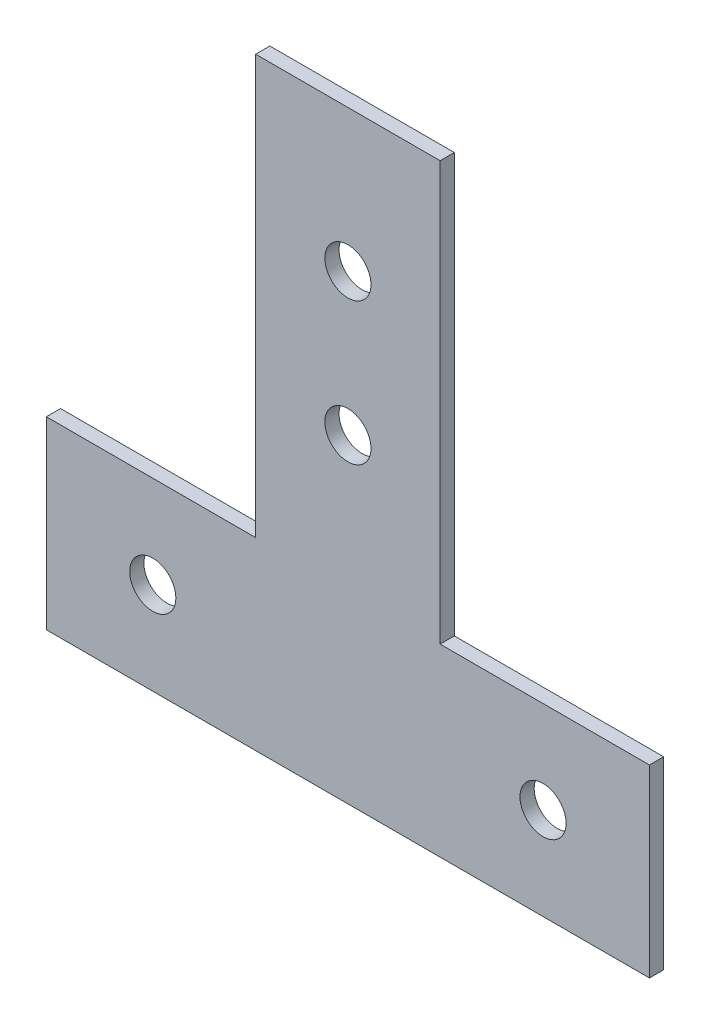
ISO-10303-21;
HEADER;
FILE_DESCRIPTION(('STEP AP214'),'2;1');
FILE_NAME('part.step','',(''),(''),'','','');
FILE_SCHEMA(('AUTOMOTIVE_DESIGN { 1 0 10303 214 1 1 1 1 }'));
ENDSEC;
DATA;
#1=APPLICATION_CONTEXT('core data for automotive mechanical design processes');
#2=APPLICATION_PROTOCOL_DEFINITION('international standard','automotive_design',2000,#1);
#3=PRODUCT_CONTEXT('',#1,'mechanical');
#4=PRODUCT('Part','Part','',(#3));
#5=PRODUCT_RELATED_PRODUCT_CATEGORY('part','',(#4));
#6=PRODUCT_DEFINITION_FORMATION('','',#4);
#7=PRODUCT_DEFINITION_CONTEXT('part definition',#1,'design');
#8=PRODUCT_DEFINITION('design','',#6,#7);
#9=PRODUCT_DEFINITION_SHAPE('','',#8);
#10=(LENGTH_UNIT() NAMED_UNIT(*) SI_UNIT(.MILLI.,.METRE.));
#11=(NAMED_UNIT(*) PLANE_ANGLE_UNIT() SI_UNIT($,.RADIAN.));
#12=(NAMED_UNIT(*) SI_UNIT($,.STERADIAN.) SOLID_ANGLE_UNIT());
#13=UNCERTAINTY_MEASURE_WITH_UNIT(LENGTH_MEASURE(1.E-05),#10,'distance_accuracy_value','');
#14=(GEOMETRIC_REPRESENTATION_CONTEXT(3) GLOBAL_UNCERTAINTY_ASSIGNED_CONTEXT((#13)) GLOBAL_UNIT_ASSIGNED_CONTEXT((#10,
#11,#12)) REPRESENTATION_CONTEXT('',''));
#15=CARTESIAN_POINT('',(0.,0.,0.));
#16=DIRECTION('',(0.,0.,1.));
#17=DIRECTION('',(1.,0.,0.));
#18=AXIS2_PLACEMENT_3D('',#15,#16,#17);
#19=CARTESIAN_POINT('',(13.,13.,2.));
#20=DIRECTION('',(0.,-1.,0.));
#21=DIRECTION('',(0.,0.,-1.));
#22=AXIS2_PLACEMENT_3D('',#19,#20,#21);
#23=PLANE('',#22);
#24=DIRECTION('',(-1.,0.,0.));
#25=VECTOR('',#24,1.);
#26=CARTESIAN_POINT('',(13.,13.,0.));
#27=LINE('',#26,#25);
#28=CARTESIAN_POINT('',(42.5,13.,0.));
#29=VERTEX_POINT('',#28);
#30=CARTESIAN_POINT('',(13.,13.,0.));
#31=VERTEX_POINT('',#30);
#32=EDGE_CURVE('E129',#29,#31,#27,.T.);
#33=ORIENTED_EDGE('',*,*,#32,.T.);
#34=DIRECTION('',(0.,0.,-1.));
#35=VECTOR('',#34,1.);
#36=CARTESIAN_POINT('',(13.,13.,2.));
#37=LINE('',#36,#35);
#38=CARTESIAN_POINT('',(13.,13.,2.));
#39=VERTEX_POINT('',#38);
#40=EDGE_CURVE('E11',#39,#31,#37,.T.);
#41=ORIENTED_EDGE('',*,*,#40,.F.);
#42=DIRECTION('',(-1.,0.,0.));
#43=VECTOR('',#42,1.);
#44=CARTESIAN_POINT('',(13.,13.,2.));
#45=LINE('',#44,#43);
#46=CARTESIAN_POINT('',(42.5,13.,2.));
#47=VERTEX_POINT('',#46);
#48=EDGE_CURVE('E144',#47,#39,#45,.T.);
#49=ORIENTED_EDGE('',*,*,#48,.F.);
#50=DIRECTION('',(0.,0.,-1.));
#51=VECTOR('',#50,1.);
#52=CARTESIAN_POINT('',(42.5,13.,2.));
#53=LINE('',#52,#51);
#54=EDGE_CURVE('E125',#47,#29,#53,.T.);
#55=ORIENTED_EDGE('',*,*,#54,.T.);
#56=EDGE_LOOP('',(#33,#41,#49,#55));
#57=FACE_BOUND('',#56,.T.);
#58=ADVANCED_FACE('F33',(#57),#23,.F.);
#59=CARTESIAN_POINT('',(13.,13.,2.));
#60=DIRECTION('',(-1.,0.,0.));
#61=DIRECTION('',(0.,0.,1.));
#62=AXIS2_PLACEMENT_3D('',#59,#60,#61);
#63=PLANE('',#62);
#64=DIRECTION('',(0.,1.,0.));
#65=VECTOR('',#64,1.);
#66=CARTESIAN_POINT('',(13.,13.,0.));
#67=LINE('',#66,#65);
#68=CARTESIAN_POINT('',(13.,72.,0.));
#69=VERTEX_POINT('',#68);
#70=EDGE_CURVE('E132',#31,#69,#67,.T.);
#71=ORIENTED_EDGE('',*,*,#70,.T.);
#72=DIRECTION('',(0.,0.,-1.));
#73=VECTOR('',#72,1.);
#74=CARTESIAN_POINT('',(13.,72.,2.));
#75=LINE('',#74,#73);
#76=CARTESIAN_POINT('',(13.,72.,2.));
#77=VERTEX_POINT('',#76);
#78=EDGE_CURVE('E41',#77,#69,#75,.T.);
#79=ORIENTED_EDGE('',*,*,#78,.F.);
#80=DIRECTION('',(0.,1.,0.));
#81=VECTOR('',#80,1.);
#82=CARTESIAN_POINT('',(13.,13.,2.));
#83=LINE('',#82,#81);
#84=EDGE_CURVE('E92',#39,#77,#83,.T.);
#85=ORIENTED_EDGE('',*,*,#84,.F.);
#86=ORIENTED_EDGE('',*,*,#40,.T.);
#87=EDGE_LOOP('',(#71,#79,#85,#86));
#88=FACE_BOUND('',#87,.T.);
#89=ADVANCED_FACE('F234',(#88),#63,.F.);
#90=CARTESIAN_POINT('',(-13.,72.,2.));
#91=DIRECTION('',(0.,-1.,0.));
#92=DIRECTION('',(0.,0.,-1.));
#93=AXIS2_PLACEMENT_3D('',#90,#91,#92);
#94=PLANE('',#93);
#95=DIRECTION('',(-1.,0.,0.));
#96=VECTOR('',#95,1.);
#97=CARTESIAN_POINT('',(-13.,72.,0.));
#98=LINE('',#97,#96);
#99=CARTESIAN_POINT('',(-13.,72.,0.));
#100=VERTEX_POINT('',#99);
#101=EDGE_CURVE('E135',#69,#100,#98,.T.);
#102=ORIENTED_EDGE('',*,*,#101,.T.);
#103=DIRECTION('',(0.,0.,-1.));
#104=VECTOR('',#103,1.);
#105=CARTESIAN_POINT('',(-13.,72.,2.));
#106=LINE('',#105,#104);
#107=CARTESIAN_POINT('',(-13.,72.,2.));
#108=VERTEX_POINT('',#107);
#109=EDGE_CURVE('E151',#108,#100,#106,.T.);
#110=ORIENTED_EDGE('',*,*,#109,.F.);
#111=DIRECTION('',(-1.,0.,0.));
#112=VECTOR('',#111,1.);
#113=CARTESIAN_POINT('',(-13.,72.,2.));
#114=LINE('',#113,#112);
#115=EDGE_CURVE('E159',#77,#108,#114,.T.);
#116=ORIENTED_EDGE('',*,*,#115,.F.);
#117=ORIENTED_EDGE('',*,*,#78,.T.);
#118=EDGE_LOOP('',(#102,#110,#116,#117));
#119=FACE_BOUND('',#118,.T.);
#120=ADVANCED_FACE('F157',(#119),#94,.F.);
#121=CARTESIAN_POINT('',(-13.,13.,2.));
#122=DIRECTION('',(1.,0.,0.));
#123=DIRECTION('',(0.,0.,-1.));
#124=AXIS2_PLACEMENT_3D('',#121,#122,#123);
#125=PLANE('',#124);
#126=DIRECTION('',(0.,-1.,0.));
#127=VECTOR('',#126,1.);
#128=CARTESIAN_POINT('',(-13.,13.,0.));
#129=LINE('',#128,#127);
#130=CARTESIAN_POINT('',(-13.,13.,0.));
#131=VERTEX_POINT('',#130);
#132=EDGE_CURVE('E137',#100,#131,#129,.T.);
#133=ORIENTED_EDGE('',*,*,#132,.T.);
#134=DIRECTION('',(0.,0.,-1.));
#135=VECTOR('',#134,1.);
#136=CARTESIAN_POINT('',(-13.,13.,2.));
#137=LINE('',#136,#135);
#138=CARTESIAN_POINT('',(-13.,13.,2.));
#139=VERTEX_POINT('',#138);
#140=EDGE_CURVE('E148',#139,#131,#137,.T.);
#141=ORIENTED_EDGE('',*,*,#140,.F.);
#142=DIRECTION('',(0.,-1.,0.));
#143=VECTOR('',#142,1.);
#144=CARTESIAN_POINT('',(-13.,13.,2.));
#145=LINE('',#144,#143);
#146=EDGE_CURVE('E171',#108,#139,#145,.T.);
#147=ORIENTED_EDGE('',*,*,#146,.F.);
#148=ORIENTED_EDGE('',*,*,#109,.T.);
#149=EDGE_LOOP('',(#133,#141,#147,#148));
#150=FACE_BOUND('',#149,.T.);
#151=ADVANCED_FACE('F167',(#150),#125,.F.);
#152=CARTESIAN_POINT('',(-42.5,13.,2.));
#153=DIRECTION('',(0.,-1.,0.));
#154=DIRECTION('',(0.,0.,-1.));
#155=AXIS2_PLACEMENT_3D('',#152,#153,#154);
#156=PLANE('',#155);
#157=DIRECTION('',(-1.,0.,0.));
#158=VECTOR('',#157,1.);
#159=CARTESIAN_POINT('',(-42.5,13.,0.));
#160=LINE('',#159,#158);
#161=CARTESIAN_POINT('',(-42.5,13.,0.));
#162=VERTEX_POINT('',#161);
#163=EDGE_CURVE('E139',#131,#162,#160,.T.);
#164=ORIENTED_EDGE('',*,*,#163,.T.);
#165=DIRECTION('',(0.,0.,-1.));
#166=VECTOR('',#165,1.);
#167=CARTESIAN_POINT('',(-42.5,13.,2.));
#168=LINE('',#167,#166);
#169=CARTESIAN_POINT('',(-42.5,13.,2.));
#170=VERTEX_POINT('',#169);
#171=EDGE_CURVE('E120',#170,#162,#168,.T.);
#172=ORIENTED_EDGE('',*,*,#171,.F.);
#173=DIRECTION('',(-1.,0.,0.));
#174=VECTOR('',#173,1.);
#175=CARTESIAN_POINT('',(-42.5,13.,2.));
#176=LINE('',#175,#174);
#177=EDGE_CURVE('E111',#139,#170,#176,.T.);
#178=ORIENTED_EDGE('',*,*,#177,.F.);
#179=ORIENTED_EDGE('',*,*,#140,.T.);
#180=EDGE_LOOP('',(#164,#172,#178,#179));
#181=FACE_BOUND('',#180,.T.);
#182=ADVANCED_FACE('F170',(#181),#156,.F.);
#183=CARTESIAN_POINT('',(-42.5,-13.,2.));
#184=DIRECTION('',(1.,0.,0.));
#185=DIRECTION('',(0.,0.,-1.));
#186=AXIS2_PLACEMENT_3D('',#183,#184,#185);
#187=PLANE('',#186);
#188=DIRECTION('',(0.,-1.,0.));
#189=VECTOR('',#188,1.);
#190=CARTESIAN_POINT('',(-42.5,-13.,0.));
#191=LINE('',#190,#189);
#192=CARTESIAN_POINT('',(-42.5,-13.,0.));
#193=VERTEX_POINT('',#192);
#194=EDGE_CURVE('E119',#162,#193,#191,.T.);
#195=ORIENTED_EDGE('',*,*,#194,.T.);
#196=DIRECTION('',(0.,0.,-1.));
#197=VECTOR('',#196,1.);
#198=CARTESIAN_POINT('',(-42.5,-13.,2.));
#199=LINE('',#198,#197);
#200=CARTESIAN_POINT('',(-42.5,-13.,2.));
#201=VERTEX_POINT('',#200);
#202=EDGE_CURVE('E116',#201,#193,#199,.T.);
#203=ORIENTED_EDGE('',*,*,#202,.F.);
#204=DIRECTION('',(0.,-1.,0.));
#205=VECTOR('',#204,1.);
#206=CARTESIAN_POINT('',(-42.5,-13.,2.));
#207=LINE('',#206,#205);
#208=EDGE_CURVE('E105',#170,#201,#207,.T.);
#209=ORIENTED_EDGE('',*,*,#208,.F.);
#210=ORIENTED_EDGE('',*,*,#171,.T.);
#211=EDGE_LOOP('',(#195,#203,#209,#210));
#212=FACE_BOUND('',#211,.T.);
#213=ADVANCED_FACE('F117',(#212),#187,.F.);
#214=CARTESIAN_POINT('',(-42.5,-13.,2.));
#215=DIRECTION('',(0.,1.,0.));
#216=DIRECTION('',(0.,0.,1.));
#217=AXIS2_PLACEMENT_3D('',#214,#215,#216);
#218=PLANE('',#217);
#219=DIRECTION('',(1.,0.,0.));
#220=VECTOR('',#219,1.);
#221=CARTESIAN_POINT('',(-42.5,-13.,0.));
#222=LINE('',#221,#220);
#223=CARTESIAN_POINT('',(42.5,-13.,0.));
#224=VERTEX_POINT('',#223);
#225=EDGE_CURVE('E78',#193,#224,#222,.T.);
#226=ORIENTED_EDGE('',*,*,#225,.T.);
#227=DIRECTION('',(0.,0.,-1.));
#228=VECTOR('',#227,1.);
#229=CARTESIAN_POINT('',(42.5,-13.,2.));
#230=LINE('',#229,#228);
#231=CARTESIAN_POINT('',(42.5,-13.,2.));
#232=VERTEX_POINT('',#231);
#233=EDGE_CURVE('E121',#232,#224,#230,.T.);
#234=ORIENTED_EDGE('',*,*,#233,.F.);
#235=DIRECTION('',(1.,0.,0.));
#236=VECTOR('',#235,1.);
#237=CARTESIAN_POINT('',(-42.5,-13.,2.));
#238=LINE('',#237,#236);
#239=EDGE_CURVE('E109',#201,#232,#238,.T.);
#240=ORIENTED_EDGE('',*,*,#239,.F.);
#241=ORIENTED_EDGE('',*,*,#202,.T.);
#242=EDGE_LOOP('',(#226,#234,#240,#241));
#243=FACE_BOUND('',#242,.T.);
#244=ADVANCED_FACE('F123',(#243),#218,.F.);
#245=CARTESIAN_POINT('',(42.5,-13.,2.));
#246=DIRECTION('',(-1.,0.,0.));
#247=DIRECTION('',(0.,0.,1.));
#248=AXIS2_PLACEMENT_3D('',#245,#246,#247);
#249=PLANE('',#248);
#250=DIRECTION('',(0.,1.,0.));
#251=VECTOR('',#250,1.);
#252=CARTESIAN_POINT('',(42.5,-13.,0.));
#253=LINE('',#252,#251);
#254=EDGE_CURVE('E84',#224,#29,#253,.T.);
#255=ORIENTED_EDGE('',*,*,#254,.T.);
#256=ORIENTED_EDGE('',*,*,#54,.F.);
#257=DIRECTION('',(0.,1.,0.));
#258=VECTOR('',#257,1.);
#259=CARTESIAN_POINT('',(42.5,-13.,2.));
#260=LINE('',#259,#258);
#261=EDGE_CURVE('E49',#232,#47,#260,.T.);
#262=ORIENTED_EDGE('',*,*,#261,.F.);
#263=ORIENTED_EDGE('',*,*,#233,.T.);
#264=EDGE_LOOP('',(#255,#256,#262,#263));
#265=FACE_BOUND('',#264,.T.);
#266=ADVANCED_FACE('F212',(#265),#249,.F.);
#267=CARTESIAN_POINT('',(42.5,13.,2.));
#268=DIRECTION('',(0.,0.,1.));
#269=DIRECTION('',(1.,0.,0.));
#270=AXIS2_PLACEMENT_3D('',#267,#268,#269);
#271=PLANE('',#270);
#272=CARTESIAN_POINT('',(27.5,0.,2.));
#273=DIRECTION('',(0.,0.,1.));
#274=DIRECTION('',(-1.,0.,0.));
#275=AXIS2_PLACEMENT_3D('',#272,#273,#274);
#276=CIRCLE('',#275,3.25);
#277=CARTESIAN_POINT('',(24.25,0.,2.));
#278=VERTEX_POINT('',#277);
#279=EDGE_CURVE('E195',#278,#278,#276,.T.);
#280=ORIENTED_EDGE('',*,*,#279,.F.);
#281=EDGE_LOOP('',(#280));
#282=FACE_BOUND('',#281,.T.);
#283=CARTESIAN_POINT('',(-27.5,0.,2.));
#284=DIRECTION('',(0.,0.,1.));
#285=DIRECTION('',(1.,0.,0.));
#286=AXIS2_PLACEMENT_3D('',#283,#284,#285);
#287=CIRCLE('',#286,3.25);
#288=CARTESIAN_POINT('',(-24.25,0.,2.));
#289=VERTEX_POINT('',#288);
#290=EDGE_CURVE('E189',#289,#289,#287,.T.);
#291=ORIENTED_EDGE('',*,*,#290,.F.);
#292=EDGE_LOOP('',(#291));
#293=FACE_BOUND('',#292,.T.);
#294=CARTESIAN_POINT('',(0.,32.,2.));
#295=DIRECTION('',(0.,0.,1.));
#296=DIRECTION('',(1.,0.,0.));
#297=AXIS2_PLACEMENT_3D('',#294,#295,#296);
#298=CIRCLE('',#297,3.25);
#299=CARTESIAN_POINT('',(3.25,32.,2.));
#300=VERTEX_POINT('',#299);
#301=EDGE_CURVE('E183',#300,#300,#298,.T.);
#302=ORIENTED_EDGE('',*,*,#301,.F.);
#303=EDGE_LOOP('',(#302));
#304=FACE_BOUND('',#303,.T.);
#305=CARTESIAN_POINT('',(0.,52.,2.));
#306=DIRECTION('',(0.,0.,1.));
#307=DIRECTION('',(1.,0.,0.));
#308=AXIS2_PLACEMENT_3D('',#305,#306,#307);
#309=CIRCLE('',#308,3.25);
#310=CARTESIAN_POINT('',(3.25,52.,2.));
#311=VERTEX_POINT('',#310);
#312=EDGE_CURVE('E177',#311,#311,#309,.T.);
#313=ORIENTED_EDGE('',*,*,#312,.F.);
#314=EDGE_LOOP('',(#313));
#315=FACE_BOUND('',#314,.T.);
#316=ORIENTED_EDGE('',*,*,#48,.T.);
#317=ORIENTED_EDGE('',*,*,#84,.T.);
#318=ORIENTED_EDGE('',*,*,#115,.T.);
#319=ORIENTED_EDGE('',*,*,#146,.T.);
#320=ORIENTED_EDGE('',*,*,#177,.T.);
#321=ORIENTED_EDGE('',*,*,#208,.T.);
#322=ORIENTED_EDGE('',*,*,#239,.T.);
#323=ORIENTED_EDGE('',*,*,#261,.T.);
#324=EDGE_LOOP('',(#316,#317,#318,#319,#320,#321,#322,#323));
#325=FACE_BOUND('',#324,.T.);
#326=ADVANCED_FACE('F107',(#282,#293,#304,#315,#325),#271,.T.);
#327=CARTESIAN_POINT('',(42.5,13.,0.));
#328=DIRECTION('',(0.,0.,1.));
#329=DIRECTION('',(1.,0.,0.));
#330=AXIS2_PLACEMENT_3D('',#327,#328,#329);
#331=PLANE('',#330);
#332=CARTESIAN_POINT('',(27.5,0.,0.));
#333=DIRECTION('',(0.,0.,1.));
#334=DIRECTION('',(-1.,0.,0.));
#335=AXIS2_PLACEMENT_3D('',#332,#333,#334);
#336=CIRCLE('',#335,3.25);
#337=CARTESIAN_POINT('',(24.25,0.,0.));
#338=VERTEX_POINT('',#337);
#339=EDGE_CURVE('E192',#338,#338,#336,.T.);
#340=ORIENTED_EDGE('',*,*,#339,.T.);
#341=EDGE_LOOP('',(#340));
#342=FACE_BOUND('',#341,.T.);
#343=CARTESIAN_POINT('',(-27.5,0.,0.));
#344=DIRECTION('',(0.,0.,1.));
#345=DIRECTION('',(1.,0.,0.));
#346=AXIS2_PLACEMENT_3D('',#343,#344,#345);
#347=CIRCLE('',#346,3.25);
#348=CARTESIAN_POINT('',(-24.25,0.,0.));
#349=VERTEX_POINT('',#348);
#350=EDGE_CURVE('E186',#349,#349,#347,.T.);
#351=ORIENTED_EDGE('',*,*,#350,.T.);
#352=EDGE_LOOP('',(#351));
#353=FACE_BOUND('',#352,.T.);
#354=CARTESIAN_POINT('',(0.,32.,0.));
#355=DIRECTION('',(0.,0.,1.));
#356=DIRECTION('',(1.,0.,0.));
#357=AXIS2_PLACEMENT_3D('',#354,#355,#356);
#358=CIRCLE('',#357,3.25);
#359=CARTESIAN_POINT('',(3.25,32.,0.));
#360=VERTEX_POINT('',#359);
#361=EDGE_CURVE('E180',#360,#360,#358,.T.);
#362=ORIENTED_EDGE('',*,*,#361,.T.);
#363=EDGE_LOOP('',(#362));
#364=FACE_BOUND('',#363,.T.);
#365=CARTESIAN_POINT('',(0.,52.,0.));
#366=DIRECTION('',(0.,0.,1.));
#367=DIRECTION('',(1.,0.,0.));
#368=AXIS2_PLACEMENT_3D('',#365,#366,#367);
#369=CIRCLE('',#368,3.25);
#370=CARTESIAN_POINT('',(3.25,52.,0.));
#371=VERTEX_POINT('',#370);
#372=EDGE_CURVE('E133',#371,#371,#369,.T.);
#373=ORIENTED_EDGE('',*,*,#372,.T.);
#374=EDGE_LOOP('',(#373));
#375=FACE_BOUND('',#374,.T.);
#376=ORIENTED_EDGE('',*,*,#32,.F.);
#377=ORIENTED_EDGE('',*,*,#254,.F.);
#378=ORIENTED_EDGE('',*,*,#225,.F.);
#379=ORIENTED_EDGE('',*,*,#194,.F.);
#380=ORIENTED_EDGE('',*,*,#163,.F.);
#381=ORIENTED_EDGE('',*,*,#132,.F.);
#382=ORIENTED_EDGE('',*,*,#101,.F.);
#383=ORIENTED_EDGE('',*,*,#70,.F.);
#384=EDGE_LOOP('',(#376,#377,#378,#379,#380,#381,#382,#383));
#385=FACE_BOUND('',#384,.T.);
#386=ADVANCED_FACE('F163',(#342,#353,#364,#375,#385),#331,.F.);
#387=CARTESIAN_POINT('',(0.,52.,0.));
#388=DIRECTION('',(0.,0.,1.));
#389=DIRECTION('',(1.,0.,0.));
#390=AXIS2_PLACEMENT_3D('',#387,#388,#389);
#391=CYLINDRICAL_SURFACE('',#390,3.25);
#392=ORIENTED_EDGE('',*,*,#372,.F.);
#393=EDGE_LOOP('',(#392));
#394=FACE_BOUND('',#393,.T.);
#395=ORIENTED_EDGE('',*,*,#312,.T.);
#396=EDGE_LOOP('',(#395));
#397=FACE_BOUND('',#396,.T.);
#398=ADVANCED_FACE('F220',(#394,#397),#391,.F.);
#399=CARTESIAN_POINT('',(0.,32.,0.));
#400=DIRECTION('',(0.,0.,1.));
#401=DIRECTION('',(1.,0.,0.));
#402=AXIS2_PLACEMENT_3D('',#399,#400,#401);
#403=CYLINDRICAL_SURFACE('',#402,3.25);
#404=ORIENTED_EDGE('',*,*,#361,.F.);
#405=EDGE_LOOP('',(#404));
#406=FACE_BOUND('',#405,.T.);
#407=ORIENTED_EDGE('',*,*,#301,.T.);
#408=EDGE_LOOP('',(#407));
#409=FACE_BOUND('',#408,.T.);
#410=ADVANCED_FACE('F222',(#406,#409),#403,.F.);
#411=CARTESIAN_POINT('',(-27.5,0.,0.));
#412=DIRECTION('',(0.,0.,1.));
#413=DIRECTION('',(1.,0.,0.));
#414=AXIS2_PLACEMENT_3D('',#411,#412,#413);
#415=CYLINDRICAL_SURFACE('',#414,3.25);
#416=ORIENTED_EDGE('',*,*,#350,.F.);
#417=EDGE_LOOP('',(#416));
#418=FACE_BOUND('',#417,.T.);
#419=ORIENTED_EDGE('',*,*,#290,.T.);
#420=EDGE_LOOP('',(#419));
#421=FACE_BOUND('',#420,.T.);
#422=ADVANCED_FACE('F206',(#418,#421),#415,.F.);
#423=CARTESIAN_POINT('',(27.5,0.,0.));
#424=DIRECTION('',(0.,0.,1.));
#425=DIRECTION('',(1.,0.,0.));
#426=AXIS2_PLACEMENT_3D('',#423,#424,#425);
#427=CYLINDRICAL_SURFACE('',#426,3.25);
#428=ORIENTED_EDGE('',*,*,#339,.F.);
#429=EDGE_LOOP('',(#428));
#430=FACE_BOUND('',#429,.T.);
#431=ORIENTED_EDGE('',*,*,#279,.T.);
#432=EDGE_LOOP('',(#431));
#433=FACE_BOUND('',#432,.T.);
#434=ADVANCED_FACE('F203',(#430,#433),#427,.F.);
#435=CLOSED_SHELL('',(#58,#89,#120,#151,#182,#213,#244,#266,#326,#386,#398,#410,#422,#434));
#436=MANIFOLD_SOLID_BREP('B2',#435);
#437=ADVANCED_BREP_SHAPE_REPRESENTATION('',(#18,#436),#14);
#438=SHAPE_DEFINITION_REPRESENTATION(#9,#437);
ENDSEC;
END-ISO-10303-21;
